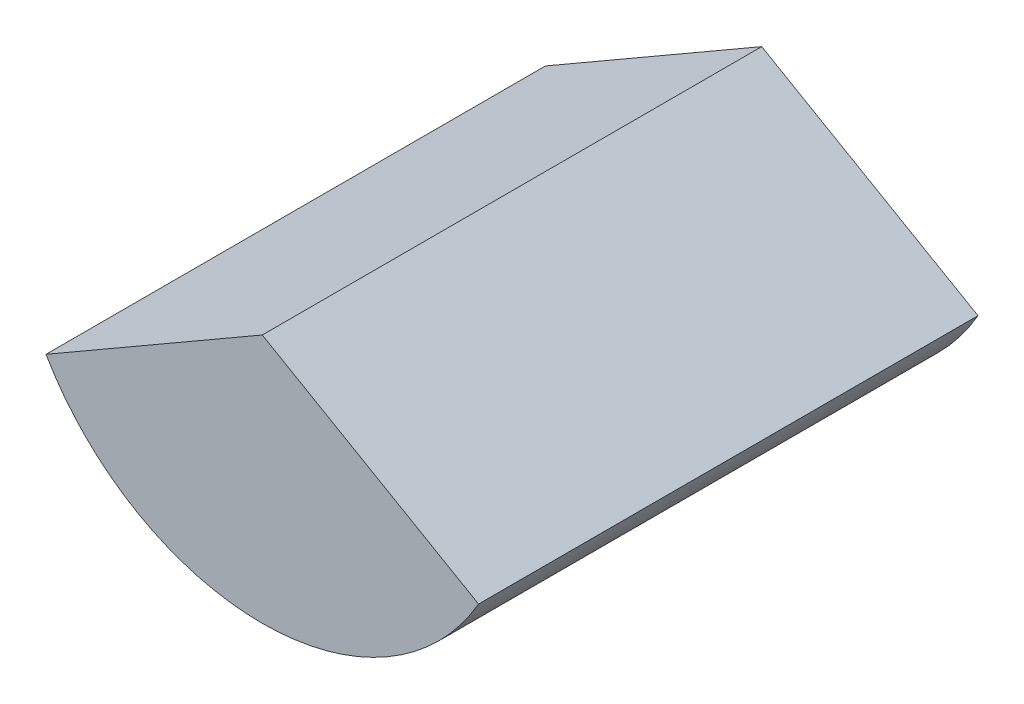
ISO-10303-21;
HEADER;
FILE_DESCRIPTION(('STEP AP214'),'2;1');
FILE_NAME('part.step','',(''),(''),'','','');
FILE_SCHEMA(('AUTOMOTIVE_DESIGN { 1 0 10303 214 1 1 1 1 }'));
ENDSEC;
DATA;
#1=APPLICATION_CONTEXT('core data for automotive mechanical design processes');
#2=APPLICATION_PROTOCOL_DEFINITION('international standard','automotive_design',2000,#1);
#3=PRODUCT_CONTEXT('',#1,'mechanical');
#4=PRODUCT('Part','Part','',(#3));
#5=PRODUCT_RELATED_PRODUCT_CATEGORY('part','',(#4));
#6=PRODUCT_DEFINITION_FORMATION('','',#4);
#7=PRODUCT_DEFINITION_CONTEXT('part definition',#1,'design');
#8=PRODUCT_DEFINITION('design','',#6,#7);
#9=PRODUCT_DEFINITION_SHAPE('','',#8);
#10=(LENGTH_UNIT() NAMED_UNIT(*) SI_UNIT(.MILLI.,.METRE.));
#11=(NAMED_UNIT(*) PLANE_ANGLE_UNIT() SI_UNIT($,.RADIAN.));
#12=(NAMED_UNIT(*) SI_UNIT($,.STERADIAN.) SOLID_ANGLE_UNIT());
#13=UNCERTAINTY_MEASURE_WITH_UNIT(LENGTH_MEASURE(1.E-05),#10,'distance_accuracy_value','');
#14=(GEOMETRIC_REPRESENTATION_CONTEXT(3) GLOBAL_UNCERTAINTY_ASSIGNED_CONTEXT((#13)) GLOBAL_UNIT_ASSIGNED_CONTEXT((#10,
#11,#12)) REPRESENTATION_CONTEXT('',''));
#15=CARTESIAN_POINT('',(0.,0.,0.));
#16=DIRECTION('',(0.,0.,1.));
#17=DIRECTION('',(1.,0.,0.));
#18=AXIS2_PLACEMENT_3D('',#15,#16,#17);
#19=CARTESIAN_POINT('',(0.,0.,50.));
#20=DIRECTION('',(-0.499999999999998,-0.86602540378444,0.));
#21=DIRECTION('',(0.86602540378444,-0.499999999999998,0.));
#22=AXIS2_PLACEMENT_3D('',#19,#20,#21);
#23=PLANE('',#22);
#24=DIRECTION('',(-0.86602540378444,0.499999999999998,0.));
#25=VECTOR('',#24,1.);
#26=CARTESIAN_POINT('',(0.,0.,0.));
#27=LINE('',#26,#25);
#28=CARTESIAN_POINT('',(21.650635094611,-12.5,0.));
#29=VERTEX_POINT('',#28);
#30=CARTESIAN_POINT('',(0.,0.,0.));
#31=VERTEX_POINT('',#30);
#32=EDGE_CURVE('E80',#29,#31,#27,.T.);
#33=ORIENTED_EDGE('',*,*,#32,.T.);
#34=DIRECTION('',(0.,0.,-1.));
#35=VECTOR('',#34,1.);
#36=CARTESIAN_POINT('',(0.,0.,50.));
#37=LINE('',#36,#35);
#38=CARTESIAN_POINT('',(0.,0.,50.));
#39=VERTEX_POINT('',#38);
#40=EDGE_CURVE('E11',#39,#31,#37,.T.);
#41=ORIENTED_EDGE('',*,*,#40,.F.);
#42=DIRECTION('',(-0.86602540378444,0.499999999999998,0.));
#43=VECTOR('',#42,1.);
#44=CARTESIAN_POINT('',(0.,0.,50.));
#45=LINE('',#44,#43);
#46=CARTESIAN_POINT('',(21.650635094611,-12.5,50.));
#47=VERTEX_POINT('',#46);
#48=EDGE_CURVE('E73',#47,#39,#45,.T.);
#49=ORIENTED_EDGE('',*,*,#48,.F.);
#50=DIRECTION('',(0.,0.,-1.));
#51=VECTOR('',#50,1.);
#52=CARTESIAN_POINT('',(21.650635094611,-12.5,50.));
#53=LINE('',#52,#51);
#54=EDGE_CURVE('E81',#47,#29,#53,.T.);
#55=ORIENTED_EDGE('',*,*,#54,.T.);
#56=EDGE_LOOP('',(#33,#41,#49,#55));
#57=FACE_BOUND('',#56,.T.);
#58=ADVANCED_FACE('F33',(#57),#23,.F.);
#59=CARTESIAN_POINT('',(0.,0.,50.));
#60=DIRECTION('',(0.499999999999996,-0.866025403784441,0.));
#61=DIRECTION('',(0.866025403784441,0.499999999999996,0.));
#62=AXIS2_PLACEMENT_3D('',#59,#60,#61);
#63=PLANE('',#62);
#64=DIRECTION('',(-0.866025403784441,-0.499999999999996,0.));
#65=VECTOR('',#64,1.);
#66=CARTESIAN_POINT('',(0.,0.,0.));
#67=LINE('',#66,#65);
#68=CARTESIAN_POINT('',(-21.650635094611,-12.4999999999999,0.));
#69=VERTEX_POINT('',#68);
#70=EDGE_CURVE('E61',#31,#69,#67,.T.);
#71=ORIENTED_EDGE('',*,*,#70,.T.);
#72=DIRECTION('',(0.,0.,-1.));
#73=VECTOR('',#72,1.);
#74=CARTESIAN_POINT('',(-21.650635094611,-12.4999999999999,50.));
#75=LINE('',#74,#73);
#76=CARTESIAN_POINT('',(-21.650635094611,-12.4999999999999,50.));
#77=VERTEX_POINT('',#76);
#78=EDGE_CURVE('E41',#77,#69,#75,.T.);
#79=ORIENTED_EDGE('',*,*,#78,.F.);
#80=DIRECTION('',(-0.866025403784441,-0.499999999999996,0.));
#81=VECTOR('',#80,1.);
#82=CARTESIAN_POINT('',(0.,0.,50.));
#83=LINE('',#82,#81);
#84=EDGE_CURVE('E69',#39,#77,#83,.T.);
#85=ORIENTED_EDGE('',*,*,#84,.F.);
#86=ORIENTED_EDGE('',*,*,#40,.T.);
#87=EDGE_LOOP('',(#71,#79,#85,#86));
#88=FACE_BOUND('',#87,.T.);
#89=ADVANCED_FACE('F70',(#88),#63,.F.);
#90=CARTESIAN_POINT('',(0.,0.,50.));
#91=DIRECTION('',(0.,0.,-1.));
#92=DIRECTION('',(-1.,0.,0.));
#93=AXIS2_PLACEMENT_3D('',#90,#91,#92);
#94=CYLINDRICAL_SURFACE('',#93,25.);
#95=CARTESIAN_POINT('',(0.,0.,0.));
#96=DIRECTION('',(0.,0.,1.));
#97=DIRECTION('',(1.,0.,0.));
#98=AXIS2_PLACEMENT_3D('',#95,#96,#97);
#99=CIRCLE('',#98,25.);
#100=EDGE_CURVE('E66',#69,#29,#99,.T.);
#101=ORIENTED_EDGE('',*,*,#100,.T.);
#102=ORIENTED_EDGE('',*,*,#54,.F.);
#103=CARTESIAN_POINT('',(0.,0.,50.));
#104=DIRECTION('',(0.,0.,1.));
#105=DIRECTION('',(1.,0.,0.));
#106=AXIS2_PLACEMENT_3D('',#103,#104,#105);
#107=CIRCLE('',#106,25.);
#108=EDGE_CURVE('E49',#77,#47,#107,.T.);
#109=ORIENTED_EDGE('',*,*,#108,.F.);
#110=ORIENTED_EDGE('',*,*,#78,.T.);
#111=EDGE_LOOP('',(#101,#102,#109,#110));
#112=FACE_BOUND('',#111,.T.);
#113=ADVANCED_FACE('F92',(#112),#94,.T.);
#114=CARTESIAN_POINT('',(0.,0.,50.));
#115=DIRECTION('',(0.,0.,1.));
#116=DIRECTION('',(1.,0.,0.));
#117=AXIS2_PLACEMENT_3D('',#114,#115,#116);
#118=PLANE('',#117);
#119=ORIENTED_EDGE('',*,*,#48,.T.);
#120=ORIENTED_EDGE('',*,*,#84,.T.);
#121=ORIENTED_EDGE('',*,*,#108,.T.);
#122=EDGE_LOOP('',(#119,#120,#121));
#123=FACE_BOUND('',#122,.T.);
#124=ADVANCED_FACE('F76',(#123),#118,.T.);
#125=CARTESIAN_POINT('',(0.,0.,0.));
#126=DIRECTION('',(0.,0.,1.));
#127=DIRECTION('',(1.,0.,0.));
#128=AXIS2_PLACEMENT_3D('',#125,#126,#127);
#129=PLANE('',#128);
#130=CARTESIAN_POINT('',(0.,-13.611730671946,0.));
#131=DIRECTION('',(0.,0.,-1.));
#132=DIRECTION('',(-1.,0.,0.));
#133=AXIS2_PLACEMENT_3D('',#130,#131,#132);
#134=CIRCLE('',#133,5.);
#135=CARTESIAN_POINT('',(-5.,-13.611730671946,0.));
#136=VERTEX_POINT('',#135);
#137=EDGE_CURVE('E87',#136,#136,#134,.T.);
#138=ORIENTED_EDGE('',*,*,#137,.F.);
#139=EDGE_LOOP('',(#138));
#140=FACE_BOUND('',#139,.T.);
#141=ORIENTED_EDGE('',*,*,#32,.F.);
#142=ORIENTED_EDGE('',*,*,#100,.F.);
#143=ORIENTED_EDGE('',*,*,#70,.F.);
#144=EDGE_LOOP('',(#141,#142,#143));
#145=FACE_BOUND('',#144,.T.);
#146=ADVANCED_FACE('F93',(#140,#145),#129,.F.);
#147=CARTESIAN_POINT('',(0.,-13.611730671946,10.));
#148=DIRECTION('',(0.,0.,-1.));
#149=DIRECTION('',(-1.,0.,0.));
#150=AXIS2_PLACEMENT_3D('',#147,#148,#149);
#151=CYLINDRICAL_SURFACE('',#150,5.);
#152=CARTESIAN_POINT('',(0.,-13.611730671946,10.));
#153=DIRECTION('',(0.,0.,-1.));
#154=DIRECTION('',(-1.,0.,0.));
#155=AXIS2_PLACEMENT_3D('',#152,#153,#154);
#156=CIRCLE('',#155,5.);
#157=CARTESIAN_POINT('',(-5.,-13.611730671946,10.));
#158=VERTEX_POINT('',#157);
#159=EDGE_CURVE('E83',#158,#158,#156,.T.);
#160=ORIENTED_EDGE('',*,*,#159,.F.);
#161=EDGE_LOOP('',(#160));
#162=FACE_BOUND('',#161,.T.);
#163=ORIENTED_EDGE('',*,*,#137,.T.);
#164=EDGE_LOOP('',(#163));
#165=FACE_BOUND('',#164,.T.);
#166=ADVANCED_FACE('F95',(#162,#165),#151,.F.);
#167=CARTESIAN_POINT('',(0.,-13.611730671946,10.));
#168=DIRECTION('',(0.,0.,-1.));
#169=DIRECTION('',(-1.,0.,0.));
#170=AXIS2_PLACEMENT_3D('',#167,#168,#169);
#171=PLANE('',#170);
#172=ORIENTED_EDGE('',*,*,#159,.T.);
#173=EDGE_LOOP('',(#172));
#174=FACE_BOUND('',#173,.T.);
#175=ADVANCED_FACE('F102',(#174),#171,.T.);
#176=CLOSED_SHELL('',(#58,#89,#113,#124,#146,#166,#175));
#177=MANIFOLD_SOLID_BREP('B2',#176);
#178=ADVANCED_BREP_SHAPE_REPRESENTATION('',(#18,#177),#14);
#179=SHAPE_DEFINITION_REPRESENTATION(#9,#178);
ENDSEC;
END-ISO-10303-21;
